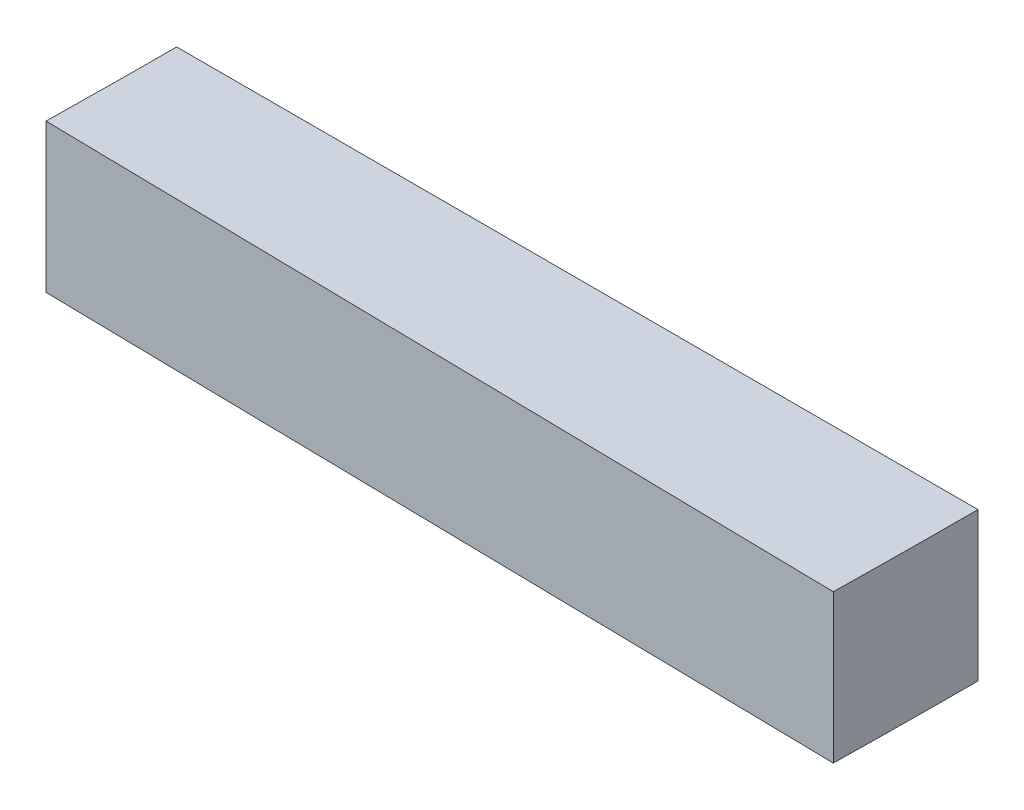
ISO-10303-21;
HEADER;
FILE_DESCRIPTION(('STEP AP214'),'2;1');
FILE_NAME('part.step','',(''),(''),'','','');
FILE_SCHEMA(('AUTOMOTIVE_DESIGN { 1 0 10303 214 1 1 1 1 }'));
ENDSEC;
DATA;
#1=APPLICATION_CONTEXT('core data for automotive mechanical design processes');
#2=APPLICATION_PROTOCOL_DEFINITION('international standard','automotive_design',2000,#1);
#3=PRODUCT_CONTEXT('',#1,'mechanical');
#4=PRODUCT('Part','Part','',(#3));
#5=PRODUCT_RELATED_PRODUCT_CATEGORY('part','',(#4));
#6=PRODUCT_DEFINITION_FORMATION('','',#4);
#7=PRODUCT_DEFINITION_CONTEXT('part definition',#1,'design');
#8=PRODUCT_DEFINITION('design','',#6,#7);
#9=PRODUCT_DEFINITION_SHAPE('','',#8);
#10=(LENGTH_UNIT() NAMED_UNIT(*) SI_UNIT(.MILLI.,.METRE.));
#11=(NAMED_UNIT(*) PLANE_ANGLE_UNIT() SI_UNIT($,.RADIAN.));
#12=(NAMED_UNIT(*) SI_UNIT($,.STERADIAN.) SOLID_ANGLE_UNIT());
#13=UNCERTAINTY_MEASURE_WITH_UNIT(LENGTH_MEASURE(1.E-05),#10,'distance_accuracy_value','');
#14=(GEOMETRIC_REPRESENTATION_CONTEXT(3) GLOBAL_UNCERTAINTY_ASSIGNED_CONTEXT((#13)) GLOBAL_UNIT_ASSIGNED_CONTEXT((#10,
#11,#12)) REPRESENTATION_CONTEXT('',''));
#15=CARTESIAN_POINT('',(0.,0.,0.));
#16=DIRECTION('',(0.,0.,1.));
#17=DIRECTION('',(1.,0.,0.));
#18=AXIS2_PLACEMENT_3D('',#15,#16,#17);
#19=CARTESIAN_POINT('',(-127.,22.1501657379232,0.));
#20=DIRECTION('',(0.,1.,0.));
#21=DIRECTION('',(0.,0.,1.));
#22=AXIS2_PLACEMENT_3D('',#19,#20,#21);
#23=CYLINDRICAL_SURFACE('',#22,127.);
#24=CARTESIAN_POINT('',(-127.,2.54,0.));
#25=DIRECTION('',(0.,1.,0.));
#26=DIRECTION('',(0.,0.,1.));
#27=AXIS2_PLACEMENT_3D('',#24,#25,#26);
#28=CIRCLE('',#27,127.);
#29=CARTESIAN_POINT('',(-0.0193427151383088,2.54,2.21645561753501));
#30=VERTEX_POINT('',#29);
#31=CARTESIAN_POINT('',(0.,2.54,0.));
#32=VERTEX_POINT('',#31);
#33=EDGE_CURVE('E11',#30,#32,#28,.T.);
#34=ORIENTED_EDGE('',*,*,#33,.T.);
#35=DIRECTION('',(0.,-1.,0.));
#36=VECTOR('',#35,1.);
#37=CARTESIAN_POINT('',(0.,0.,0.));
#38=LINE('',#37,#36);
#39=CARTESIAN_POINT('',(0.,0.,0.));
#40=VERTEX_POINT('',#39);
#41=EDGE_CURVE('E99',#32,#40,#38,.T.);
#42=ORIENTED_EDGE('',*,*,#41,.T.);
#43=CARTESIAN_POINT('',(-127.,0.,0.));
#44=DIRECTION('',(0.,1.,0.));
#45=DIRECTION('',(0.,0.,1.));
#46=AXIS2_PLACEMENT_3D('',#43,#44,#45);
#47=CIRCLE('',#46,127.);
#48=CARTESIAN_POINT('',(-0.0193427151383088,0.,2.21645561753501));
#49=VERTEX_POINT('',#48);
#50=EDGE_CURVE('E81',#49,#40,#47,.T.);
#51=ORIENTED_EDGE('',*,*,#50,.F.);
#52=DIRECTION('',(0.,-1.,0.));
#53=VECTOR('',#52,1.);
#54=CARTESIAN_POINT('',(-0.0193427151383088,0.,2.21645561753501));
#55=LINE('',#54,#53);
#56=EDGE_CURVE('E107',#30,#49,#55,.T.);
#57=ORIENTED_EDGE('',*,*,#56,.F.);
#58=EDGE_LOOP('',(#34,#42,#51,#57));
#59=FACE_BOUND('',#58,.T.);
#60=ADVANCED_FACE('F41',(#59),#23,.F.);
#61=CARTESIAN_POINT('',(-0.0193427151383088,2.54,2.21645561753501));
#62=DIRECTION('',(0.,-1.,0.));
#63=DIRECTION('',(0.,0.,-1.));
#64=AXIS2_PLACEMENT_3D('',#61,#62,#63);
#65=PLANE('',#64);
#66=CARTESIAN_POINT('',(-127.,2.54,0.));
#67=DIRECTION('',(0.,1.,0.));
#68=DIRECTION('',(0.,0.,1.));
#69=AXIS2_PLACEMENT_3D('',#66,#67,#68);
#70=CIRCLE('',#69,140.716);
#71=CARTESIAN_POINT('',(13.6945682716268,2.54,2.45583282422879));
#72=VERTEX_POINT('',#71);
#73=CARTESIAN_POINT('',(13.716,2.54,0.));
#74=VERTEX_POINT('',#73);
#75=EDGE_CURVE('E49',#72,#74,#70,.T.);
#76=ORIENTED_EDGE('',*,*,#75,.T.);
#77=DIRECTION('',(-1.,0.,0.));
#78=VECTOR('',#77,1.);
#79=CARTESIAN_POINT('',(0.,2.54,0.));
#80=LINE('',#79,#78);
#81=EDGE_CURVE('E105',#74,#32,#80,.T.);
#82=ORIENTED_EDGE('',*,*,#81,.T.);
#83=ORIENTED_EDGE('',*,*,#33,.F.);
#84=DIRECTION('',(-0.999847695156391,0.,-0.0174524064372835));
#85=VECTOR('',#84,1.);
#86=CARTESIAN_POINT('',(-0.0193427151383088,2.54,2.21645561753501));
#87=LINE('',#86,#85);
#88=EDGE_CURVE('E93',#72,#30,#87,.T.);
#89=ORIENTED_EDGE('',*,*,#88,.F.);
#90=EDGE_LOOP('',(#76,#82,#83,#89));
#91=FACE_BOUND('',#90,.T.);
#92=ADVANCED_FACE('F43',(#91),#65,.F.);
#93=CARTESIAN_POINT('',(-127.,22.1501657379232,0.));
#94=DIRECTION('',(0.,1.,0.));
#95=DIRECTION('',(0.,0.,1.));
#96=AXIS2_PLACEMENT_3D('',#93,#94,#95);
#97=CYLINDRICAL_SURFACE('',#96,140.716);
#98=CARTESIAN_POINT('',(-127.,0.,0.));
#99=DIRECTION('',(0.,1.,0.));
#100=DIRECTION('',(0.,0.,1.));
#101=AXIS2_PLACEMENT_3D('',#98,#99,#100);
#102=CIRCLE('',#101,140.716);
#103=CARTESIAN_POINT('',(13.6945682716268,0.,2.45583282422879));
#104=VERTEX_POINT('',#103);
#105=CARTESIAN_POINT('',(13.716,0.,0.));
#106=VERTEX_POINT('',#105);
#107=EDGE_CURVE('E92',#104,#106,#102,.T.);
#108=ORIENTED_EDGE('',*,*,#107,.T.);
#109=DIRECTION('',(0.,1.,0.));
#110=VECTOR('',#109,1.);
#111=CARTESIAN_POINT('',(13.716,0.,0.));
#112=LINE('',#111,#110);
#113=EDGE_CURVE('E100',#106,#74,#112,.T.);
#114=ORIENTED_EDGE('',*,*,#113,.T.);
#115=ORIENTED_EDGE('',*,*,#75,.F.);
#116=DIRECTION('',(0.,1.,0.));
#117=VECTOR('',#116,1.);
#118=CARTESIAN_POINT('',(13.6945682716268,0.,2.45583282422879));
#119=LINE('',#118,#117);
#120=EDGE_CURVE('E110',#104,#72,#119,.T.);
#121=ORIENTED_EDGE('',*,*,#120,.F.);
#122=EDGE_LOOP('',(#108,#114,#115,#121));
#123=FACE_BOUND('',#122,.T.);
#124=ADVANCED_FACE('F113',(#123),#97,.T.);
#125=CARTESIAN_POINT('',(-0.0193427151383088,0.,2.21645561753501));
#126=DIRECTION('',(0.,1.,0.));
#127=DIRECTION('',(0.,0.,1.));
#128=AXIS2_PLACEMENT_3D('',#125,#126,#127);
#129=PLANE('',#128);
#130=DIRECTION('',(0.999847695156391,0.,0.0174524064372835));
#131=VECTOR('',#130,1.);
#132=CARTESIAN_POINT('',(-0.0193427151383088,0.,2.21645561753501));
#133=LINE('',#132,#131);
#134=EDGE_CURVE('E87',#49,#104,#133,.T.);
#135=ORIENTED_EDGE('',*,*,#134,.F.);
#136=ORIENTED_EDGE('',*,*,#50,.T.);
#137=DIRECTION('',(1.,0.,0.));
#138=VECTOR('',#137,1.);
#139=CARTESIAN_POINT('',(0.,0.,0.));
#140=LINE('',#139,#138);
#141=EDGE_CURVE('E84',#40,#106,#140,.T.);
#142=ORIENTED_EDGE('',*,*,#141,.T.);
#143=ORIENTED_EDGE('',*,*,#107,.F.);
#144=EDGE_LOOP('',(#135,#136,#142,#143));
#145=FACE_BOUND('',#144,.T.);
#146=ADVANCED_FACE('F83',(#145),#129,.F.);
#147=CARTESIAN_POINT('',(-0.0193427151383088,0.,2.21645561753501));
#148=DIRECTION('',(0.0174524064372835,0.,-0.999847695156391));
#149=DIRECTION('',(-0.999847695156391,0.,-0.0174524064372835));
#150=AXIS2_PLACEMENT_3D('',#147,#148,#149);
#151=PLANE('',#150);
#152=ORIENTED_EDGE('',*,*,#56,.T.);
#153=ORIENTED_EDGE('',*,*,#134,.T.);
#154=ORIENTED_EDGE('',*,*,#120,.T.);
#155=ORIENTED_EDGE('',*,*,#88,.T.);
#156=EDGE_LOOP('',(#152,#153,#154,#155));
#157=FACE_BOUND('',#156,.T.);
#158=ADVANCED_FACE('F115',(#157),#151,.F.);
#159=CARTESIAN_POINT('',(0.,0.,0.));
#160=DIRECTION('',(0.,0.,-1.));
#161=DIRECTION('',(-1.,0.,0.));
#162=AXIS2_PLACEMENT_3D('',#159,#160,#161);
#163=PLANE('',#162);
#164=ORIENTED_EDGE('',*,*,#41,.F.);
#165=ORIENTED_EDGE('',*,*,#81,.F.);
#166=ORIENTED_EDGE('',*,*,#113,.F.);
#167=ORIENTED_EDGE('',*,*,#141,.F.);
#168=EDGE_LOOP('',(#164,#165,#166,#167));
#169=FACE_BOUND('',#168,.T.);
#170=ADVANCED_FACE('F97',(#169),#163,.T.);
#171=CLOSED_SHELL('',(#60,#92,#124,#146,#158,#170));
#172=MANIFOLD_SOLID_BREP('B2',#171);
#173=ADVANCED_BREP_SHAPE_REPRESENTATION('',(#18,#172),#14);
#174=SHAPE_DEFINITION_REPRESENTATION(#9,#173);
ENDSEC;
END-ISO-10303-21;
